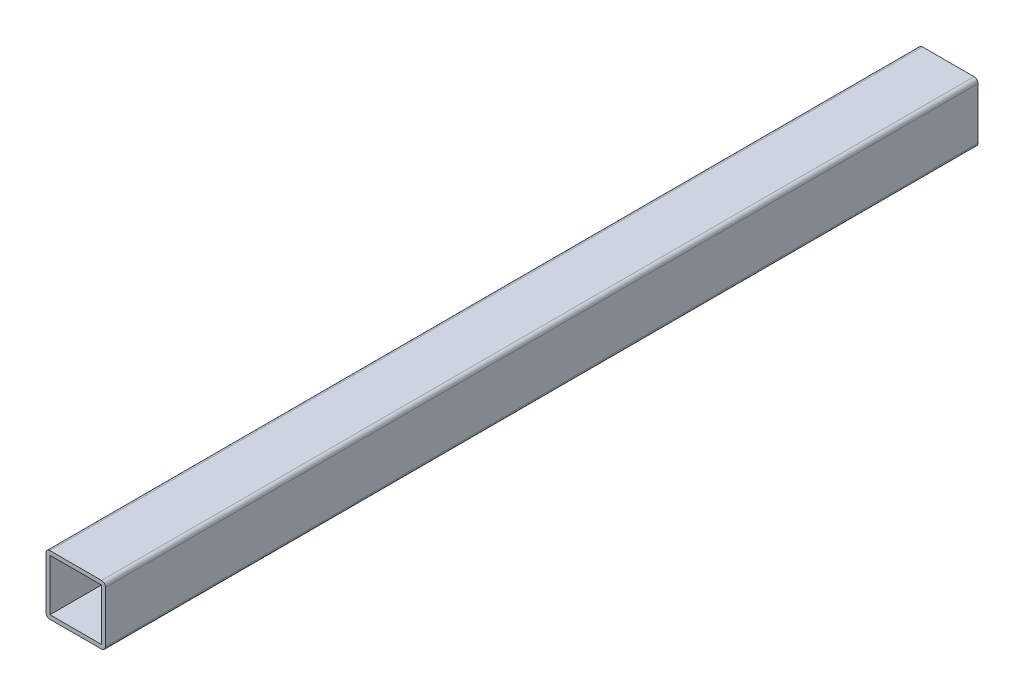
ISO-10303-21;
HEADER;
FILE_DESCRIPTION(('STEP AP214'),'2;1');
FILE_NAME('part.step','',(''),(''),'','','');
FILE_SCHEMA(('AUTOMOTIVE_DESIGN { 1 0 10303 214 1 1 1 1 }'));
ENDSEC;
DATA;
#1=APPLICATION_CONTEXT('core data for automotive mechanical design processes');
#2=APPLICATION_PROTOCOL_DEFINITION('international standard','automotive_design',2000,#1);
#3=PRODUCT_CONTEXT('',#1,'mechanical');
#4=PRODUCT('Part','Part','',(#3));
#5=PRODUCT_RELATED_PRODUCT_CATEGORY('part','',(#4));
#6=PRODUCT_DEFINITION_FORMATION('','',#4);
#7=PRODUCT_DEFINITION_CONTEXT('part definition',#1,'design');
#8=PRODUCT_DEFINITION('design','',#6,#7);
#9=PRODUCT_DEFINITION_SHAPE('','',#8);
#10=(LENGTH_UNIT() NAMED_UNIT(*) SI_UNIT(.MILLI.,.METRE.));
#11=(NAMED_UNIT(*) PLANE_ANGLE_UNIT() SI_UNIT($,.RADIAN.));
#12=(NAMED_UNIT(*) SI_UNIT($,.STERADIAN.) SOLID_ANGLE_UNIT());
#13=UNCERTAINTY_MEASURE_WITH_UNIT(LENGTH_MEASURE(1.E-05),#10,'distance_accuracy_value','');
#14=(GEOMETRIC_REPRESENTATION_CONTEXT(3) GLOBAL_UNCERTAINTY_ASSIGNED_CONTEXT((#13)) GLOBAL_UNIT_ASSIGNED_CONTEXT((#10,
#11,#12)) REPRESENTATION_CONTEXT('',''));
#15=CARTESIAN_POINT('',(0.,0.,0.));
#16=DIRECTION('',(0.,0.,1.));
#17=DIRECTION('',(1.,0.,0.));
#18=AXIS2_PLACEMENT_3D('',#15,#16,#17);
#19=CARTESIAN_POINT('',(13.,-13.,-220.));
#20=DIRECTION('',(0.,0.,1.));
#21=DIRECTION('',(1.,0.,0.));
#22=AXIS2_PLACEMENT_3D('',#19,#20,#21);
#23=CYLINDRICAL_SURFACE('',#22,2.);
#24=DIRECTION('',(0.,0.,1.));
#25=VECTOR('',#24,1.);
#26=CARTESIAN_POINT('',(15.,-13.,-220.));
#27=LINE('',#26,#25);
#28=CARTESIAN_POINT('',(15.,-13.,-220.));
#29=VERTEX_POINT('',#28);
#30=CARTESIAN_POINT('',(15.,-13.,220.));
#31=VERTEX_POINT('',#30);
#32=EDGE_CURVE('E37',#29,#31,#27,.T.);
#33=ORIENTED_EDGE('',*,*,#32,.T.);
#34=CARTESIAN_POINT('',(13.,-13.,220.));
#35=DIRECTION('',(0.,0.,1.));
#36=DIRECTION('',(-1.,0.,0.));
#37=AXIS2_PLACEMENT_3D('',#34,#35,#36);
#38=CIRCLE('',#37,2.);
#39=CARTESIAN_POINT('',(13.,-15.,220.));
#40=VERTEX_POINT('',#39);
#41=EDGE_CURVE('E153',#40,#31,#38,.T.);
#42=ORIENTED_EDGE('',*,*,#41,.F.);
#43=DIRECTION('',(0.,0.,1.));
#44=VECTOR('',#43,1.);
#45=CARTESIAN_POINT('',(13.,-15.,-220.));
#46=LINE('',#45,#44);
#47=CARTESIAN_POINT('',(13.,-15.,-220.));
#48=VERTEX_POINT('',#47);
#49=EDGE_CURVE('E11',#48,#40,#46,.T.);
#50=ORIENTED_EDGE('',*,*,#49,.F.);
#51=CARTESIAN_POINT('',(13.,-13.,-220.));
#52=DIRECTION('',(0.,0.,1.));
#53=DIRECTION('',(-1.,0.,0.));
#54=AXIS2_PLACEMENT_3D('',#51,#52,#53);
#55=CIRCLE('',#54,2.);
#56=EDGE_CURVE('E184',#48,#29,#55,.T.);
#57=ORIENTED_EDGE('',*,*,#56,.T.);
#58=EDGE_LOOP('',(#33,#42,#50,#57));
#59=FACE_BOUND('',#58,.T.);
#60=ADVANCED_FACE('F34',(#59),#23,.T.);
#61=CARTESIAN_POINT('',(-13.,-15.,-220.));
#62=DIRECTION('',(0.,-1.,0.));
#63=DIRECTION('',(0.,0.,-1.));
#64=AXIS2_PLACEMENT_3D('',#61,#62,#63);
#65=PLANE('',#64);
#66=ORIENTED_EDGE('',*,*,#49,.T.);
#67=DIRECTION('',(1.,0.,0.));
#68=VECTOR('',#67,1.);
#69=CARTESIAN_POINT('',(-13.,-15.,220.));
#70=LINE('',#69,#68);
#71=CARTESIAN_POINT('',(-13.,-15.,220.));
#72=VERTEX_POINT('',#71);
#73=EDGE_CURVE('E174',#72,#40,#70,.T.);
#74=ORIENTED_EDGE('',*,*,#73,.F.);
#75=DIRECTION('',(0.,0.,1.));
#76=VECTOR('',#75,1.);
#77=CARTESIAN_POINT('',(-13.,-15.,-220.));
#78=LINE('',#77,#76);
#79=CARTESIAN_POINT('',(-13.,-15.,-220.));
#80=VERTEX_POINT('',#79);
#81=EDGE_CURVE('E42',#80,#72,#78,.T.);
#82=ORIENTED_EDGE('',*,*,#81,.F.);
#83=DIRECTION('',(1.,0.,0.));
#84=VECTOR('',#83,1.);
#85=CARTESIAN_POINT('',(-13.,-15.,-220.));
#86=LINE('',#85,#84);
#87=EDGE_CURVE('E207',#80,#48,#86,.T.);
#88=ORIENTED_EDGE('',*,*,#87,.T.);
#89=EDGE_LOOP('',(#66,#74,#82,#88));
#90=FACE_BOUND('',#89,.T.);
#91=ADVANCED_FACE('F228',(#90),#65,.T.);
#92=CARTESIAN_POINT('',(-13.,-13.,-220.));
#93=DIRECTION('',(0.,0.,1.));
#94=DIRECTION('',(1.,0.,0.));
#95=AXIS2_PLACEMENT_3D('',#92,#93,#94);
#96=CYLINDRICAL_SURFACE('',#95,2.);
#97=ORIENTED_EDGE('',*,*,#81,.T.);
#98=CARTESIAN_POINT('',(-13.,-13.,220.));
#99=DIRECTION('',(0.,0.,1.));
#100=DIRECTION('',(1.,0.,0.));
#101=AXIS2_PLACEMENT_3D('',#98,#99,#100);
#102=CIRCLE('',#101,2.);
#103=CARTESIAN_POINT('',(-15.,-13.,220.));
#104=VERTEX_POINT('',#103);
#105=EDGE_CURVE('E171',#104,#72,#102,.T.);
#106=ORIENTED_EDGE('',*,*,#105,.F.);
#107=DIRECTION('',(0.,0.,1.));
#108=VECTOR('',#107,1.);
#109=CARTESIAN_POINT('',(-15.,-13.,-220.));
#110=LINE('',#109,#108);
#111=CARTESIAN_POINT('',(-15.,-13.,-220.));
#112=VERTEX_POINT('',#111);
#113=EDGE_CURVE('E211',#112,#104,#110,.T.);
#114=ORIENTED_EDGE('',*,*,#113,.F.);
#115=CARTESIAN_POINT('',(-13.,-13.,-220.));
#116=DIRECTION('',(0.,0.,1.));
#117=DIRECTION('',(1.,0.,0.));
#118=AXIS2_PLACEMENT_3D('',#115,#116,#117);
#119=CIRCLE('',#118,2.);
#120=EDGE_CURVE('E204',#112,#80,#119,.T.);
#121=ORIENTED_EDGE('',*,*,#120,.T.);
#122=EDGE_LOOP('',(#97,#106,#114,#121));
#123=FACE_BOUND('',#122,.T.);
#124=ADVANCED_FACE('F249',(#123),#96,.T.);
#125=CARTESIAN_POINT('',(-15.,13.,-220.));
#126=DIRECTION('',(-1.,0.,0.));
#127=DIRECTION('',(0.,-1.,0.));
#128=AXIS2_PLACEMENT_3D('',#125,#126,#127);
#129=PLANE('',#128);
#130=ORIENTED_EDGE('',*,*,#113,.T.);
#131=DIRECTION('',(0.,-1.,0.));
#132=VECTOR('',#131,1.);
#133=CARTESIAN_POINT('',(-15.,13.,220.));
#134=LINE('',#133,#132);
#135=CARTESIAN_POINT('',(-15.,13.,220.));
#136=VERTEX_POINT('',#135);
#137=EDGE_CURVE('E168',#136,#104,#134,.T.);
#138=ORIENTED_EDGE('',*,*,#137,.F.);
#139=DIRECTION('',(0.,0.,1.));
#140=VECTOR('',#139,1.);
#141=CARTESIAN_POINT('',(-15.,13.,-220.));
#142=LINE('',#141,#140);
#143=CARTESIAN_POINT('',(-15.,13.,-220.));
#144=VERTEX_POINT('',#143);
#145=EDGE_CURVE('E213',#144,#136,#142,.T.);
#146=ORIENTED_EDGE('',*,*,#145,.F.);
#147=DIRECTION('',(0.,-1.,0.));
#148=VECTOR('',#147,1.);
#149=CARTESIAN_POINT('',(-15.,13.,-220.));
#150=LINE('',#149,#148);
#151=EDGE_CURVE('E201',#144,#112,#150,.T.);
#152=ORIENTED_EDGE('',*,*,#151,.T.);
#153=EDGE_LOOP('',(#130,#138,#146,#152));
#154=FACE_BOUND('',#153,.T.);
#155=ADVANCED_FACE('F246',(#154),#129,.T.);
#156=CARTESIAN_POINT('',(-13.,13.,-220.));
#157=DIRECTION('',(0.,0.,1.));
#158=DIRECTION('',(1.,0.,0.));
#159=AXIS2_PLACEMENT_3D('',#156,#157,#158);
#160=CYLINDRICAL_SURFACE('',#159,2.);
#161=ORIENTED_EDGE('',*,*,#145,.T.);
#162=CARTESIAN_POINT('',(-13.,13.,220.));
#163=DIRECTION('',(0.,0.,1.));
#164=DIRECTION('',(1.,0.,0.));
#165=AXIS2_PLACEMENT_3D('',#162,#163,#164);
#166=CIRCLE('',#165,2.);
#167=CARTESIAN_POINT('',(-13.,15.,220.));
#168=VERTEX_POINT('',#167);
#169=EDGE_CURVE('E165',#168,#136,#166,.T.);
#170=ORIENTED_EDGE('',*,*,#169,.F.);
#171=DIRECTION('',(0.,0.,1.));
#172=VECTOR('',#171,1.);
#173=CARTESIAN_POINT('',(-13.,15.,-220.));
#174=LINE('',#173,#172);
#175=CARTESIAN_POINT('',(-13.,15.,-220.));
#176=VERTEX_POINT('',#175);
#177=EDGE_CURVE('E215',#176,#168,#174,.T.);
#178=ORIENTED_EDGE('',*,*,#177,.F.);
#179=CARTESIAN_POINT('',(-13.,13.,-220.));
#180=DIRECTION('',(0.,0.,1.));
#181=DIRECTION('',(1.,0.,0.));
#182=AXIS2_PLACEMENT_3D('',#179,#180,#181);
#183=CIRCLE('',#182,2.);
#184=EDGE_CURVE('E198',#176,#144,#183,.T.);
#185=ORIENTED_EDGE('',*,*,#184,.T.);
#186=EDGE_LOOP('',(#161,#170,#178,#185));
#187=FACE_BOUND('',#186,.T.);
#188=ADVANCED_FACE('F244',(#187),#160,.T.);
#189=CARTESIAN_POINT('',(-13.,15.,-220.));
#190=DIRECTION('',(0.,1.,0.));
#191=DIRECTION('',(0.,0.,1.));
#192=AXIS2_PLACEMENT_3D('',#189,#190,#191);
#193=PLANE('',#192);
#194=ORIENTED_EDGE('',*,*,#177,.T.);
#195=DIRECTION('',(-1.,0.,0.));
#196=VECTOR('',#195,1.);
#197=CARTESIAN_POINT('',(-13.,15.,220.));
#198=LINE('',#197,#196);
#199=CARTESIAN_POINT('',(13.,15.,220.));
#200=VERTEX_POINT('',#199);
#201=EDGE_CURVE('E162',#200,#168,#198,.T.);
#202=ORIENTED_EDGE('',*,*,#201,.F.);
#203=DIRECTION('',(0.,0.,1.));
#204=VECTOR('',#203,1.);
#205=CARTESIAN_POINT('',(13.,15.,-220.));
#206=LINE('',#205,#204);
#207=CARTESIAN_POINT('',(13.,15.,-220.));
#208=VERTEX_POINT('',#207);
#209=EDGE_CURVE('E217',#208,#200,#206,.T.);
#210=ORIENTED_EDGE('',*,*,#209,.F.);
#211=DIRECTION('',(-1.,0.,0.));
#212=VECTOR('',#211,1.);
#213=CARTESIAN_POINT('',(-13.,15.,-220.));
#214=LINE('',#213,#212);
#215=EDGE_CURVE('E195',#208,#176,#214,.T.);
#216=ORIENTED_EDGE('',*,*,#215,.T.);
#217=EDGE_LOOP('',(#194,#202,#210,#216));
#218=FACE_BOUND('',#217,.T.);
#219=ADVANCED_FACE('F242',(#218),#193,.T.);
#220=CARTESIAN_POINT('',(13.,13.,-220.));
#221=DIRECTION('',(0.,0.,1.));
#222=DIRECTION('',(1.,0.,0.));
#223=AXIS2_PLACEMENT_3D('',#220,#221,#222);
#224=CYLINDRICAL_SURFACE('',#223,2.);
#225=ORIENTED_EDGE('',*,*,#209,.T.);
#226=CARTESIAN_POINT('',(13.,13.,220.));
#227=DIRECTION('',(0.,0.,1.));
#228=DIRECTION('',(-1.,0.,0.));
#229=AXIS2_PLACEMENT_3D('',#226,#227,#228);
#230=CIRCLE('',#229,2.);
#231=CARTESIAN_POINT('',(15.,13.,220.));
#232=VERTEX_POINT('',#231);
#233=EDGE_CURVE('E159',#232,#200,#230,.T.);
#234=ORIENTED_EDGE('',*,*,#233,.F.);
#235=DIRECTION('',(0.,0.,1.));
#236=VECTOR('',#235,1.);
#237=CARTESIAN_POINT('',(15.,13.,-220.));
#238=LINE('',#237,#236);
#239=CARTESIAN_POINT('',(15.,13.,-220.));
#240=VERTEX_POINT('',#239);
#241=EDGE_CURVE('E218',#240,#232,#238,.T.);
#242=ORIENTED_EDGE('',*,*,#241,.F.);
#243=CARTESIAN_POINT('',(13.,13.,-220.));
#244=DIRECTION('',(0.,0.,1.));
#245=DIRECTION('',(-1.,0.,0.));
#246=AXIS2_PLACEMENT_3D('',#243,#244,#245);
#247=CIRCLE('',#246,2.);
#248=EDGE_CURVE('E192',#240,#208,#247,.T.);
#249=ORIENTED_EDGE('',*,*,#248,.T.);
#250=EDGE_LOOP('',(#225,#234,#242,#249));
#251=FACE_BOUND('',#250,.T.);
#252=ADVANCED_FACE('F238',(#251),#224,.T.);
#253=CARTESIAN_POINT('',(15.,13.,-220.));
#254=DIRECTION('',(1.,0.,0.));
#255=DIRECTION('',(0.,1.,0.));
#256=AXIS2_PLACEMENT_3D('',#253,#254,#255);
#257=PLANE('',#256);
#258=ORIENTED_EDGE('',*,*,#241,.T.);
#259=DIRECTION('',(0.,1.,0.));
#260=VECTOR('',#259,1.);
#261=CARTESIAN_POINT('',(15.,13.,220.));
#262=LINE('',#261,#260);
#263=EDGE_CURVE('E156',#31,#232,#262,.T.);
#264=ORIENTED_EDGE('',*,*,#263,.F.);
#265=ORIENTED_EDGE('',*,*,#32,.F.);
#266=DIRECTION('',(0.,1.,0.));
#267=VECTOR('',#266,1.);
#268=CARTESIAN_POINT('',(15.,13.,-220.));
#269=LINE('',#268,#267);
#270=EDGE_CURVE('E189',#29,#240,#269,.T.);
#271=ORIENTED_EDGE('',*,*,#270,.T.);
#272=EDGE_LOOP('',(#258,#264,#265,#271));
#273=FACE_BOUND('',#272,.T.);
#274=ADVANCED_FACE('F222',(#273),#257,.T.);
#275=CARTESIAN_POINT('',(13.,-13.,-220.));
#276=DIRECTION('',(0.,0.,-1.));
#277=DIRECTION('',(-1.,0.,0.));
#278=AXIS2_PLACEMENT_3D('',#275,#276,#277);
#279=PLANE('',#278);
#280=DIRECTION('',(0.,-1.,0.));
#281=VECTOR('',#280,1.);
#282=CARTESIAN_POINT('',(-13.,13.,-220.));
#283=LINE('',#282,#281);
#284=CARTESIAN_POINT('',(-13.,13.,-220.));
#285=VERTEX_POINT('',#284);
#286=CARTESIAN_POINT('',(-13.,-13.,-220.));
#287=VERTEX_POINT('',#286);
#288=EDGE_CURVE('E177',#285,#287,#283,.T.);
#289=ORIENTED_EDGE('',*,*,#288,.T.);
#290=DIRECTION('',(1.,0.,0.));
#291=VECTOR('',#290,1.);
#292=CARTESIAN_POINT('',(-13.,-13.,-220.));
#293=LINE('',#292,#291);
#294=CARTESIAN_POINT('',(13.,-13.,-220.));
#295=VERTEX_POINT('',#294);
#296=EDGE_CURVE('E130',#287,#295,#293,.T.);
#297=ORIENTED_EDGE('',*,*,#296,.T.);
#298=DIRECTION('',(0.,1.,0.));
#299=VECTOR('',#298,1.);
#300=CARTESIAN_POINT('',(13.,13.,-220.));
#301=LINE('',#300,#299);
#302=CARTESIAN_POINT('',(13.,13.,-220.));
#303=VERTEX_POINT('',#302);
#304=EDGE_CURVE('E50',#295,#303,#301,.T.);
#305=ORIENTED_EDGE('',*,*,#304,.T.);
#306=DIRECTION('',(-1.,0.,0.));
#307=VECTOR('',#306,1.);
#308=CARTESIAN_POINT('',(-13.,13.,-220.));
#309=LINE('',#308,#307);
#310=EDGE_CURVE('E135',#303,#285,#309,.T.);
#311=ORIENTED_EDGE('',*,*,#310,.T.);
#312=EDGE_LOOP('',(#289,#297,#305,#311));
#313=FACE_BOUND('',#312,.T.);
#314=ORIENTED_EDGE('',*,*,#56,.F.);
#315=ORIENTED_EDGE('',*,*,#87,.F.);
#316=ORIENTED_EDGE('',*,*,#120,.F.);
#317=ORIENTED_EDGE('',*,*,#151,.F.);
#318=ORIENTED_EDGE('',*,*,#184,.F.);
#319=ORIENTED_EDGE('',*,*,#215,.F.);
#320=ORIENTED_EDGE('',*,*,#248,.F.);
#321=ORIENTED_EDGE('',*,*,#270,.F.);
#322=EDGE_LOOP('',(#314,#315,#316,#317,#318,#319,#320,#321));
#323=FACE_BOUND('',#322,.T.);
#324=ADVANCED_FACE('F232',(#313,#323),#279,.T.);
#325=CARTESIAN_POINT('',(-13.,13.,-220.));
#326=DIRECTION('',(-1.,0.,0.));
#327=DIRECTION('',(0.,-1.,0.));
#328=AXIS2_PLACEMENT_3D('',#325,#326,#327);
#329=PLANE('',#328);
#330=DIRECTION('',(0.,0.,1.));
#331=VECTOR('',#330,1.);
#332=CARTESIAN_POINT('',(-13.,13.,-220.));
#333=LINE('',#332,#331);
#334=CARTESIAN_POINT('',(-13.,13.,220.));
#335=VERTEX_POINT('',#334);
#336=EDGE_CURVE('E140',#285,#335,#333,.T.);
#337=ORIENTED_EDGE('',*,*,#336,.T.);
#338=DIRECTION('',(0.,-1.,0.));
#339=VECTOR('',#338,1.);
#340=CARTESIAN_POINT('',(-13.,13.,220.));
#341=LINE('',#340,#339);
#342=CARTESIAN_POINT('',(-13.,-13.,220.));
#343=VERTEX_POINT('',#342);
#344=EDGE_CURVE('E138',#335,#343,#341,.T.);
#345=ORIENTED_EDGE('',*,*,#344,.T.);
#346=DIRECTION('',(0.,0.,1.));
#347=VECTOR('',#346,1.);
#348=CARTESIAN_POINT('',(-13.,-13.,-220.));
#349=LINE('',#348,#347);
#350=EDGE_CURVE('E123',#287,#343,#349,.T.);
#351=ORIENTED_EDGE('',*,*,#350,.F.);
#352=ORIENTED_EDGE('',*,*,#288,.F.);
#353=EDGE_LOOP('',(#337,#345,#351,#352));
#354=FACE_BOUND('',#353,.T.);
#355=ADVANCED_FACE('F139',(#354),#329,.F.);
#356=CARTESIAN_POINT('',(-13.,13.,-220.));
#357=DIRECTION('',(0.,1.,0.));
#358=DIRECTION('',(0.,0.,1.));
#359=AXIS2_PLACEMENT_3D('',#356,#357,#358);
#360=PLANE('',#359);
#361=DIRECTION('',(0.,0.,1.));
#362=VECTOR('',#361,1.);
#363=CARTESIAN_POINT('',(13.,13.,-220.));
#364=LINE('',#363,#362);
#365=CARTESIAN_POINT('',(13.,13.,220.));
#366=VERTEX_POINT('',#365);
#367=EDGE_CURVE('E185',#303,#366,#364,.T.);
#368=ORIENTED_EDGE('',*,*,#367,.T.);
#369=DIRECTION('',(-1.,0.,0.));
#370=VECTOR('',#369,1.);
#371=CARTESIAN_POINT('',(-13.,13.,220.));
#372=LINE('',#371,#370);
#373=EDGE_CURVE('E149',#366,#335,#372,.T.);
#374=ORIENTED_EDGE('',*,*,#373,.T.);
#375=ORIENTED_EDGE('',*,*,#336,.F.);
#376=ORIENTED_EDGE('',*,*,#310,.F.);
#377=EDGE_LOOP('',(#368,#374,#375,#376));
#378=FACE_BOUND('',#377,.T.);
#379=ADVANCED_FACE('F324',(#378),#360,.F.);
#380=CARTESIAN_POINT('',(13.,13.,-220.));
#381=DIRECTION('',(1.,0.,0.));
#382=DIRECTION('',(0.,1.,0.));
#383=AXIS2_PLACEMENT_3D('',#380,#381,#382);
#384=PLANE('',#383);
#385=DIRECTION('',(0.,0.,1.));
#386=VECTOR('',#385,1.);
#387=CARTESIAN_POINT('',(13.,-13.,-220.));
#388=LINE('',#387,#386);
#389=CARTESIAN_POINT('',(13.,-13.,220.));
#390=VERTEX_POINT('',#389);
#391=EDGE_CURVE('E134',#295,#390,#388,.T.);
#392=ORIENTED_EDGE('',*,*,#391,.T.);
#393=DIRECTION('',(0.,1.,0.));
#394=VECTOR('',#393,1.);
#395=CARTESIAN_POINT('',(13.,13.,220.));
#396=LINE('',#395,#394);
#397=EDGE_CURVE('E147',#390,#366,#396,.T.);
#398=ORIENTED_EDGE('',*,*,#397,.T.);
#399=ORIENTED_EDGE('',*,*,#367,.F.);
#400=ORIENTED_EDGE('',*,*,#304,.F.);
#401=EDGE_LOOP('',(#392,#398,#399,#400));
#402=FACE_BOUND('',#401,.T.);
#403=ADVANCED_FACE('F333',(#402),#384,.F.);
#404=CARTESIAN_POINT('',(-13.,-13.,-220.));
#405=DIRECTION('',(0.,-1.,0.));
#406=DIRECTION('',(1.,0.,0.));
#407=AXIS2_PLACEMENT_3D('',#404,#405,#406);
#408=PLANE('',#407);
#409=ORIENTED_EDGE('',*,*,#350,.T.);
#410=DIRECTION('',(1.,0.,0.));
#411=VECTOR('',#410,1.);
#412=CARTESIAN_POINT('',(-13.,-13.,220.));
#413=LINE('',#412,#411);
#414=EDGE_CURVE('E127',#343,#390,#413,.T.);
#415=ORIENTED_EDGE('',*,*,#414,.T.);
#416=ORIENTED_EDGE('',*,*,#391,.F.);
#417=ORIENTED_EDGE('',*,*,#296,.F.);
#418=EDGE_LOOP('',(#409,#415,#416,#417));
#419=FACE_BOUND('',#418,.T.);
#420=ADVANCED_FACE('F125',(#419),#408,.F.);
#421=CARTESIAN_POINT('',(13.,-13.,220.));
#422=DIRECTION('',(0.,0.,-1.));
#423=DIRECTION('',(-1.,0.,0.));
#424=AXIS2_PLACEMENT_3D('',#421,#422,#423);
#425=PLANE('',#424);
#426=ORIENTED_EDGE('',*,*,#41,.T.);
#427=ORIENTED_EDGE('',*,*,#263,.T.);
#428=ORIENTED_EDGE('',*,*,#233,.T.);
#429=ORIENTED_EDGE('',*,*,#201,.T.);
#430=ORIENTED_EDGE('',*,*,#169,.T.);
#431=ORIENTED_EDGE('',*,*,#137,.T.);
#432=ORIENTED_EDGE('',*,*,#105,.T.);
#433=ORIENTED_EDGE('',*,*,#73,.T.);
#434=EDGE_LOOP('',(#426,#427,#428,#429,#430,#431,#432,#433));
#435=FACE_BOUND('',#434,.T.);
#436=ORIENTED_EDGE('',*,*,#344,.F.);
#437=ORIENTED_EDGE('',*,*,#373,.F.);
#438=ORIENTED_EDGE('',*,*,#397,.F.);
#439=ORIENTED_EDGE('',*,*,#414,.F.);
#440=EDGE_LOOP('',(#436,#437,#438,#439));
#441=FACE_BOUND('',#440,.T.);
#442=ADVANCED_FACE('F145',(#435,#441),#425,.F.);
#443=CLOSED_SHELL('',(#60,#91,#124,#155,#188,#219,#252,#274,#324,#355,#379,#403,#420,#442));
#444=MANIFOLD_SOLID_BREP('B2',#443);
#445=ADVANCED_BREP_SHAPE_REPRESENTATION('',(#18,#444),#14);
#446=SHAPE_DEFINITION_REPRESENTATION(#9,#445);
ENDSEC;
END-ISO-10303-21;
